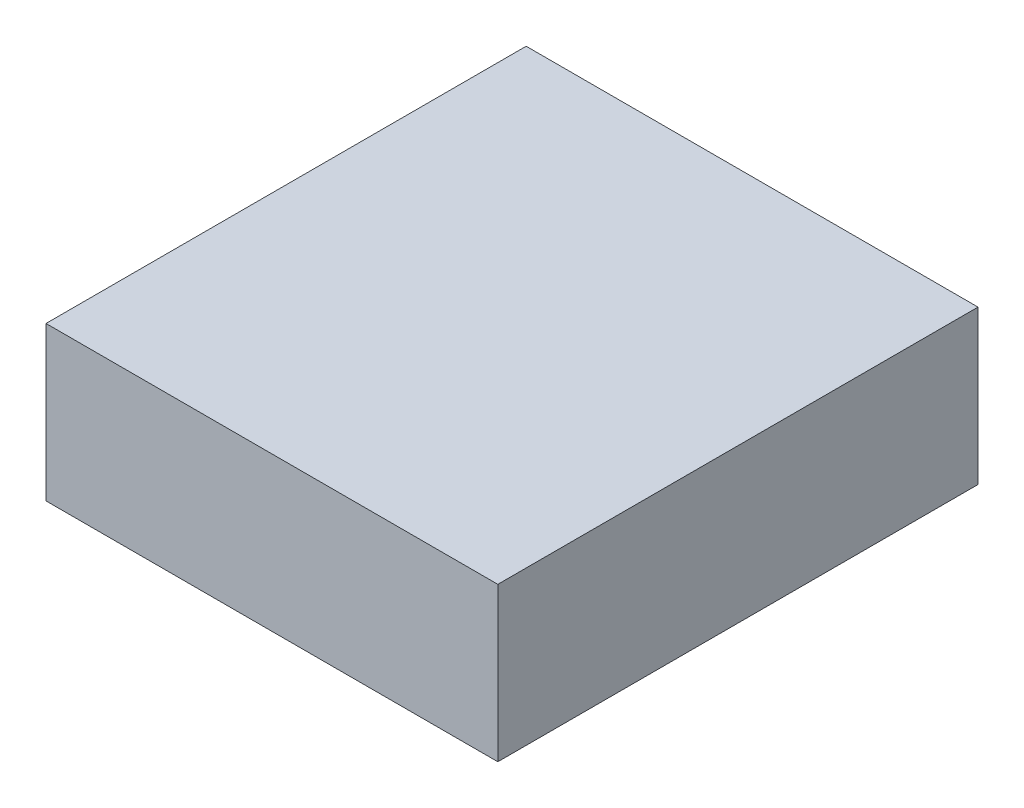
ISO-10303-21;
HEADER;
FILE_DESCRIPTION(('STEP AP214'),'2;1');
FILE_NAME('part.step','',(''),(''),'','','');
FILE_SCHEMA(('AUTOMOTIVE_DESIGN { 1 0 10303 214 1 1 1 1 }'));
ENDSEC;
DATA;
#1=APPLICATION_CONTEXT('core data for automotive mechanical design processes');
#2=APPLICATION_PROTOCOL_DEFINITION('international standard','automotive_design',2000,#1);
#3=PRODUCT_CONTEXT('',#1,'mechanical');
#4=PRODUCT('Part','Part','',(#3));
#5=PRODUCT_RELATED_PRODUCT_CATEGORY('part','',(#4));
#6=PRODUCT_DEFINITION_FORMATION('','',#4);
#7=PRODUCT_DEFINITION_CONTEXT('part definition',#1,'design');
#8=PRODUCT_DEFINITION('design','',#6,#7);
#9=PRODUCT_DEFINITION_SHAPE('','',#8);
#10=(LENGTH_UNIT() NAMED_UNIT(*) SI_UNIT(.MILLI.,.METRE.));
#11=(NAMED_UNIT(*) PLANE_ANGLE_UNIT() SI_UNIT($,.RADIAN.));
#12=(NAMED_UNIT(*) SI_UNIT($,.STERADIAN.) SOLID_ANGLE_UNIT());
#13=UNCERTAINTY_MEASURE_WITH_UNIT(LENGTH_MEASURE(1.E-05),#10,'distance_accuracy_value','');
#14=(GEOMETRIC_REPRESENTATION_CONTEXT(3) GLOBAL_UNCERTAINTY_ASSIGNED_CONTEXT((#13)) GLOBAL_UNIT_ASSIGNED_CONTEXT((#10,
#11,#12)) REPRESENTATION_CONTEXT('',''));
#15=CARTESIAN_POINT('',(0.,0.,0.));
#16=DIRECTION('',(0.,0.,1.));
#17=DIRECTION('',(1.,0.,0.));
#18=AXIS2_PLACEMENT_3D('',#15,#16,#17);
#19=CARTESIAN_POINT('',(45.085,30.67,47.915));
#20=DIRECTION('',(-1.,0.,0.));
#21=DIRECTION('',(0.,0.,1.));
#22=AXIS2_PLACEMENT_3D('',#19,#20,#21);
#23=PLANE('',#22);
#24=DIRECTION('',(0.,0.,-1.));
#25=VECTOR('',#24,1.);
#26=CARTESIAN_POINT('',(45.085,0.,47.915));
#27=LINE('',#26,#25);
#28=CARTESIAN_POINT('',(45.085,0.,47.915));
#29=VERTEX_POINT('',#28);
#30=CARTESIAN_POINT('',(45.085,0.,-47.915));
#31=VERTEX_POINT('',#30);
#32=EDGE_CURVE('E101',#29,#31,#27,.T.);
#33=ORIENTED_EDGE('',*,*,#32,.T.);
#34=DIRECTION('',(0.,-1.,0.));
#35=VECTOR('',#34,1.);
#36=CARTESIAN_POINT('',(45.085,30.67,-47.915));
#37=LINE('',#36,#35);
#38=CARTESIAN_POINT('',(45.085,30.67,-47.915));
#39=VERTEX_POINT('',#38);
#40=EDGE_CURVE('E11',#39,#31,#37,.T.);
#41=ORIENTED_EDGE('',*,*,#40,.F.);
#42=DIRECTION('',(0.,0.,-1.));
#43=VECTOR('',#42,1.);
#44=CARTESIAN_POINT('',(45.085,30.67,47.915));
#45=LINE('',#44,#43);
#46=CARTESIAN_POINT('',(45.085,30.67,47.915));
#47=VERTEX_POINT('',#46);
#48=EDGE_CURVE('E89',#47,#39,#45,.T.);
#49=ORIENTED_EDGE('',*,*,#48,.F.);
#50=DIRECTION('',(0.,-1.,0.));
#51=VECTOR('',#50,1.);
#52=CARTESIAN_POINT('',(45.085,30.67,47.915));
#53=LINE('',#52,#51);
#54=EDGE_CURVE('E97',#47,#29,#53,.T.);
#55=ORIENTED_EDGE('',*,*,#54,.T.);
#56=EDGE_LOOP('',(#33,#41,#49,#55));
#57=FACE_BOUND('',#56,.T.);
#58=ADVANCED_FACE('F38',(#57),#23,.F.);
#59=CARTESIAN_POINT('',(-45.085,30.67,-47.915));
#60=DIRECTION('',(0.,0.,1.));
#61=DIRECTION('',(1.,0.,0.));
#62=AXIS2_PLACEMENT_3D('',#59,#60,#61);
#63=PLANE('',#62);
#64=DIRECTION('',(-1.,0.,0.));
#65=VECTOR('',#64,1.);
#66=CARTESIAN_POINT('',(-45.085,0.,-47.915));
#67=LINE('',#66,#65);
#68=CARTESIAN_POINT('',(-45.085,0.,-47.915));
#69=VERTEX_POINT('',#68);
#70=EDGE_CURVE('E93',#31,#69,#67,.T.);
#71=ORIENTED_EDGE('',*,*,#70,.T.);
#72=DIRECTION('',(0.,-1.,0.));
#73=VECTOR('',#72,1.);
#74=CARTESIAN_POINT('',(-45.085,30.67,-47.915));
#75=LINE('',#74,#73);
#76=CARTESIAN_POINT('',(-45.085,30.67,-47.915));
#77=VERTEX_POINT('',#76);
#78=EDGE_CURVE('E46',#77,#69,#75,.T.);
#79=ORIENTED_EDGE('',*,*,#78,.F.);
#80=DIRECTION('',(-1.,0.,0.));
#81=VECTOR('',#80,1.);
#82=CARTESIAN_POINT('',(-45.085,30.67,-47.915));
#83=LINE('',#82,#81);
#84=EDGE_CURVE('E84',#39,#77,#83,.T.);
#85=ORIENTED_EDGE('',*,*,#84,.F.);
#86=ORIENTED_EDGE('',*,*,#40,.T.);
#87=EDGE_LOOP('',(#71,#79,#85,#86));
#88=FACE_BOUND('',#87,.T.);
#89=ADVANCED_FACE('F92',(#88),#63,.F.);
#90=CARTESIAN_POINT('',(-45.085,30.67,47.915));
#91=DIRECTION('',(1.,0.,0.));
#92=DIRECTION('',(0.,0.,-1.));
#93=AXIS2_PLACEMENT_3D('',#90,#91,#92);
#94=PLANE('',#93);
#95=DIRECTION('',(0.,0.,1.));
#96=VECTOR('',#95,1.);
#97=CARTESIAN_POINT('',(-45.085,0.,47.915));
#98=LINE('',#97,#96);
#99=CARTESIAN_POINT('',(-45.085,0.,47.915));
#100=VERTEX_POINT('',#99);
#101=EDGE_CURVE('E71',#69,#100,#98,.T.);
#102=ORIENTED_EDGE('',*,*,#101,.T.);
#103=DIRECTION('',(0.,-1.,0.));
#104=VECTOR('',#103,1.);
#105=CARTESIAN_POINT('',(-45.085,30.67,47.915));
#106=LINE('',#105,#104);
#107=CARTESIAN_POINT('',(-45.085,30.67,47.915));
#108=VERTEX_POINT('',#107);
#109=EDGE_CURVE('E94',#108,#100,#106,.T.);
#110=ORIENTED_EDGE('',*,*,#109,.F.);
#111=DIRECTION('',(0.,0.,1.));
#112=VECTOR('',#111,1.);
#113=CARTESIAN_POINT('',(-45.085,30.67,47.915));
#114=LINE('',#113,#112);
#115=EDGE_CURVE('E87',#77,#108,#114,.T.);
#116=ORIENTED_EDGE('',*,*,#115,.F.);
#117=ORIENTED_EDGE('',*,*,#78,.T.);
#118=EDGE_LOOP('',(#102,#110,#116,#117));
#119=FACE_BOUND('',#118,.T.);
#120=ADVANCED_FACE('F95',(#119),#94,.F.);
#121=CARTESIAN_POINT('',(-45.085,30.67,47.915));
#122=DIRECTION('',(0.,0.,-1.));
#123=DIRECTION('',(-1.,0.,0.));
#124=AXIS2_PLACEMENT_3D('',#121,#122,#123);
#125=PLANE('',#124);
#126=DIRECTION('',(1.,0.,0.));
#127=VECTOR('',#126,1.);
#128=CARTESIAN_POINT('',(-45.085,0.,47.915));
#129=LINE('',#128,#127);
#130=EDGE_CURVE('E77',#100,#29,#129,.T.);
#131=ORIENTED_EDGE('',*,*,#130,.T.);
#132=ORIENTED_EDGE('',*,*,#54,.F.);
#133=DIRECTION('',(1.,0.,0.));
#134=VECTOR('',#133,1.);
#135=CARTESIAN_POINT('',(-45.085,30.67,47.915));
#136=LINE('',#135,#134);
#137=EDGE_CURVE('E54',#108,#47,#136,.T.);
#138=ORIENTED_EDGE('',*,*,#137,.F.);
#139=ORIENTED_EDGE('',*,*,#109,.T.);
#140=EDGE_LOOP('',(#131,#132,#138,#139));
#141=FACE_BOUND('',#140,.T.);
#142=ADVANCED_FACE('F108',(#141),#125,.F.);
#143=CARTESIAN_POINT('',(0.,30.67,0.));
#144=DIRECTION('',(0.,-1.,0.));
#145=DIRECTION('',(0.,0.,-1.));
#146=AXIS2_PLACEMENT_3D('',#143,#144,#145);
#147=PLANE('',#146);
#148=ORIENTED_EDGE('',*,*,#48,.T.);
#149=ORIENTED_EDGE('',*,*,#84,.T.);
#150=ORIENTED_EDGE('',*,*,#115,.T.);
#151=ORIENTED_EDGE('',*,*,#137,.T.);
#152=EDGE_LOOP('',(#148,#149,#150,#151));
#153=FACE_BOUND('',#152,.T.);
#154=ADVANCED_FACE('F85',(#153),#147,.F.);
#155=CARTESIAN_POINT('',(0.,0.,0.));
#156=DIRECTION('',(0.,-1.,0.));
#157=DIRECTION('',(0.,0.,-1.));
#158=AXIS2_PLACEMENT_3D('',#155,#156,#157);
#159=PLANE('',#158);
#160=ORIENTED_EDGE('',*,*,#32,.F.);
#161=ORIENTED_EDGE('',*,*,#130,.F.);
#162=ORIENTED_EDGE('',*,*,#101,.F.);
#163=ORIENTED_EDGE('',*,*,#70,.F.);
#164=EDGE_LOOP('',(#160,#161,#162,#163));
#165=FACE_BOUND('',#164,.T.);
#166=ADVANCED_FACE('F111',(#165),#159,.T.);
#167=CLOSED_SHELL('',(#58,#89,#120,#142,#154,#166));
#168=MANIFOLD_SOLID_BREP('B2',#167);
#169=ADVANCED_BREP_SHAPE_REPRESENTATION('',(#18,#168),#14);
#170=SHAPE_DEFINITION_REPRESENTATION(#9,#169);
ENDSEC;
END-ISO-10303-21;
